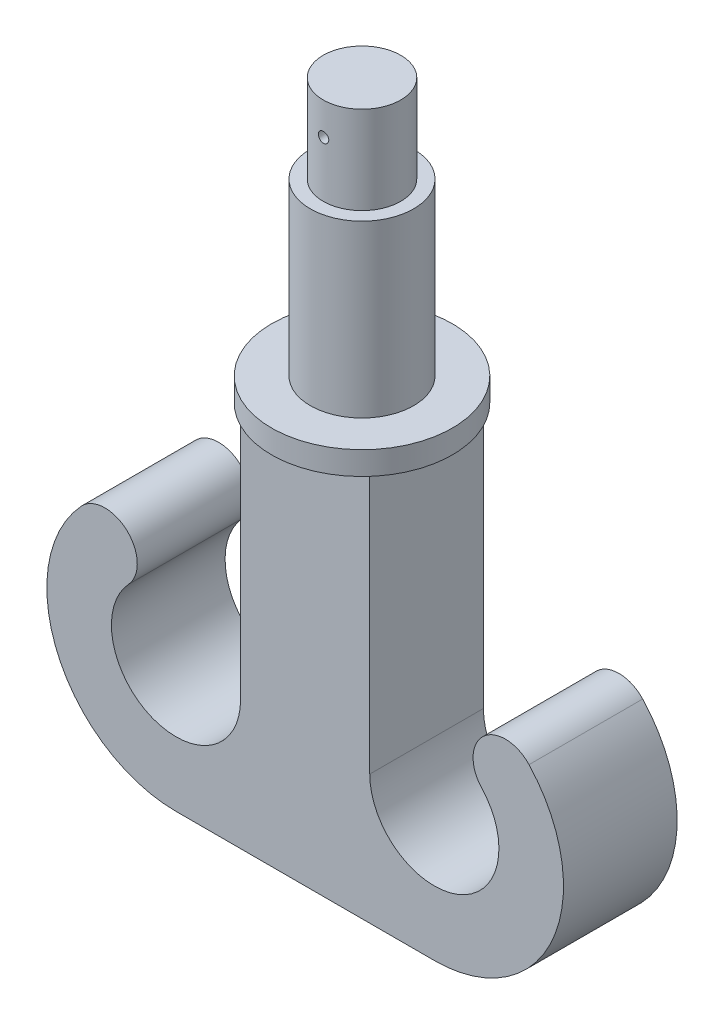
ISO-10303-21;
HEADER;
FILE_DESCRIPTION(('STEP AP214'),'2;1');
FILE_NAME('part.step','',(''),(''),'','','');
FILE_SCHEMA(('AUTOMOTIVE_DESIGN { 1 0 10303 214 1 1 1 1 }'));
ENDSEC;
DATA;
#1=APPLICATION_CONTEXT('core data for automotive mechanical design processes');
#2=APPLICATION_PROTOCOL_DEFINITION('international standard','automotive_design',2000,#1);
#3=PRODUCT_CONTEXT('',#1,'mechanical');
#4=PRODUCT('Part','Part','',(#3));
#5=PRODUCT_RELATED_PRODUCT_CATEGORY('part','',(#4));
#6=PRODUCT_DEFINITION_FORMATION('','',#4);
#7=PRODUCT_DEFINITION_CONTEXT('part definition',#1,'design');
#8=PRODUCT_DEFINITION('design','',#6,#7);
#9=PRODUCT_DEFINITION_SHAPE('','',#8);
#10=(LENGTH_UNIT() NAMED_UNIT(*) SI_UNIT(.MILLI.,.METRE.));
#11=(NAMED_UNIT(*) PLANE_ANGLE_UNIT() SI_UNIT($,.RADIAN.));
#12=(NAMED_UNIT(*) SI_UNIT($,.STERADIAN.) SOLID_ANGLE_UNIT());
#13=UNCERTAINTY_MEASURE_WITH_UNIT(LENGTH_MEASURE(1.E-05),#10,'distance_accuracy_value','');
#14=(GEOMETRIC_REPRESENTATION_CONTEXT(3) GLOBAL_UNCERTAINTY_ASSIGNED_CONTEXT((#13)) GLOBAL_UNIT_ASSIGNED_CONTEXT((#10,
#11,#12)) REPRESENTATION_CONTEXT('',''));
#15=CARTESIAN_POINT('',(0.,0.,0.));
#16=DIRECTION('',(0.,0.,1.));
#17=DIRECTION('',(1.,0.,0.));
#18=AXIS2_PLACEMENT_3D('',#15,#16,#17);
#19=CARTESIAN_POINT('',(77.4954541697351,75.5,22.));
#20=DIRECTION('',(0.,0.,-1.));
#21=DIRECTION('',(-1.,0.,0.));
#22=AXIS2_PLACEMENT_3D('',#19,#20,#21);
#23=CYLINDRICAL_SURFACE('',#22,12.5);
#24=CARTESIAN_POINT('',(77.4954541697351,75.5,-22.));
#25=DIRECTION('',(0.,0.,1.));
#26=DIRECTION('',(-1.,0.,0.));
#27=AXIS2_PLACEMENT_3D('',#24,#25,#26);
#28=CIRCLE('',#27,12.5);
#29=CARTESIAN_POINT('',(86.6606055596468,84.,-22.));
#30=VERTEX_POINT('',#29);
#31=CARTESIAN_POINT('',(68.3303027798234,67.,-22.));
#32=VERTEX_POINT('',#31);
#33=EDGE_CURVE('E164',#30,#32,#28,.T.);
#34=ORIENTED_EDGE('',*,*,#33,.T.);
#35=DIRECTION('',(0.,0.,-1.));
#36=VECTOR('',#35,1.);
#37=CARTESIAN_POINT('',(68.3303027798234,67.,22.));
#38=LINE('',#37,#36);
#39=CARTESIAN_POINT('',(68.3303027798234,67.,22.));
#40=VERTEX_POINT('',#39);
#41=EDGE_CURVE('E11',#40,#32,#38,.T.);
#42=ORIENTED_EDGE('',*,*,#41,.F.);
#43=CARTESIAN_POINT('',(77.4954541697351,75.5,22.));
#44=DIRECTION('',(0.,0.,1.));
#45=DIRECTION('',(-1.,0.,0.));
#46=AXIS2_PLACEMENT_3D('',#43,#44,#45);
#47=CIRCLE('',#46,12.5);
#48=CARTESIAN_POINT('',(86.6606055596468,84.,22.));
#49=VERTEX_POINT('',#48);
#50=EDGE_CURVE('E195',#49,#40,#47,.T.);
#51=ORIENTED_EDGE('',*,*,#50,.F.);
#52=DIRECTION('',(0.,0.,-1.));
#53=VECTOR('',#52,1.);
#54=CARTESIAN_POINT('',(86.6606055596468,84.,22.));
#55=LINE('',#54,#53);
#56=EDGE_CURVE('E160',#49,#30,#55,.T.);
#57=ORIENTED_EDGE('',*,*,#56,.T.);
#58=EDGE_LOOP('',(#34,#42,#51,#57));
#59=FACE_BOUND('',#58,.T.);
#60=ADVANCED_FACE('F45',(#59),#23,.T.);
#61=CARTESIAN_POINT('',(50.,50.,22.));
#62=DIRECTION('',(0.,0.,-1.));
#63=DIRECTION('',(-1.,0.,0.));
#64=AXIS2_PLACEMENT_3D('',#61,#62,#63);
#65=CYLINDRICAL_SURFACE('',#64,25.);
#66=CARTESIAN_POINT('',(50.,50.,-22.));
#67=DIRECTION('',(0.,0.,-1.));
#68=DIRECTION('',(-1.,0.,0.));
#69=AXIS2_PLACEMENT_3D('',#66,#67,#68);
#70=CIRCLE('',#69,25.);
#71=CARTESIAN_POINT('',(25.,50.,-22.));
#72=VERTEX_POINT('',#71);
#73=EDGE_CURVE('E168',#32,#72,#70,.T.);
#74=ORIENTED_EDGE('',*,*,#73,.T.);
#75=DIRECTION('',(0.,0.,-1.));
#76=VECTOR('',#75,1.);
#77=CARTESIAN_POINT('',(25.,50.,22.));
#78=LINE('',#77,#76);
#79=CARTESIAN_POINT('',(25.,50.,22.));
#80=VERTEX_POINT('',#79);
#81=EDGE_CURVE('E60',#80,#72,#78,.T.);
#82=ORIENTED_EDGE('',*,*,#81,.F.);
#83=CARTESIAN_POINT('',(50.,50.,22.));
#84=DIRECTION('',(0.,0.,-1.));
#85=DIRECTION('',(-1.,0.,0.));
#86=AXIS2_PLACEMENT_3D('',#83,#84,#85);
#87=CIRCLE('',#86,25.);
#88=EDGE_CURVE('E116',#40,#80,#87,.T.);
#89=ORIENTED_EDGE('',*,*,#88,.F.);
#90=ORIENTED_EDGE('',*,*,#41,.T.);
#91=EDGE_LOOP('',(#74,#82,#89,#90));
#92=FACE_BOUND('',#91,.T.);
#93=ADVANCED_FACE('F245',(#92),#65,.F.);
#94=CARTESIAN_POINT('',(25.,50.,22.));
#95=DIRECTION('',(-1.,0.,0.));
#96=DIRECTION('',(0.,0.,1.));
#97=AXIS2_PLACEMENT_3D('',#94,#95,#96);
#98=PLANE('',#97);
#99=DIRECTION('',(0.,1.,0.));
#100=VECTOR('',#99,1.);
#101=CARTESIAN_POINT('',(25.,50.,-22.));
#102=LINE('',#101,#100);
#103=CARTESIAN_POINT('',(25.,151.,-22.));
#104=VERTEX_POINT('',#103);
#105=EDGE_CURVE('E172',#72,#104,#102,.T.);
#106=ORIENTED_EDGE('',*,*,#105,.T.);
#107=DIRECTION('',(0.,0.,-1.));
#108=VECTOR('',#107,1.);
#109=CARTESIAN_POINT('',(25.,151.,22.));
#110=LINE('',#109,#108);
#111=CARTESIAN_POINT('',(25.,151.,22.));
#112=VERTEX_POINT('',#111);
#113=EDGE_CURVE('E213',#112,#104,#110,.T.);
#114=ORIENTED_EDGE('',*,*,#113,.F.);
#115=DIRECTION('',(0.,1.,0.));
#116=VECTOR('',#115,1.);
#117=CARTESIAN_POINT('',(25.,50.,22.));
#118=LINE('',#117,#116);
#119=EDGE_CURVE('E261',#80,#112,#118,.T.);
#120=ORIENTED_EDGE('',*,*,#119,.F.);
#121=ORIENTED_EDGE('',*,*,#81,.T.);
#122=EDGE_LOOP('',(#106,#114,#120,#121));
#123=FACE_BOUND('',#122,.T.);
#124=ADVANCED_FACE('F250',(#123),#98,.F.);
#125=CARTESIAN_POINT('',(-25.,50.,22.));
#126=DIRECTION('',(1.,0.,0.));
#127=DIRECTION('',(0.,0.,-1.));
#128=AXIS2_PLACEMENT_3D('',#125,#126,#127);
#129=PLANE('',#128);
#130=DIRECTION('',(0.,-1.,0.));
#131=VECTOR('',#130,1.);
#132=CARTESIAN_POINT('',(-25.,50.,-22.));
#133=LINE('',#132,#131);
#134=CARTESIAN_POINT('',(-25.,151.,-22.));
#135=VERTEX_POINT('',#134);
#136=CARTESIAN_POINT('',(-25.,50.,-22.));
#137=VERTEX_POINT('',#136);
#138=EDGE_CURVE('E180',#135,#137,#133,.T.);
#139=ORIENTED_EDGE('',*,*,#138,.T.);
#140=DIRECTION('',(0.,0.,-1.));
#141=VECTOR('',#140,1.);
#142=CARTESIAN_POINT('',(-25.,50.,22.));
#143=LINE('',#142,#141);
#144=CARTESIAN_POINT('',(-25.,50.,22.));
#145=VERTEX_POINT('',#144);
#146=EDGE_CURVE('E206',#145,#137,#143,.T.);
#147=ORIENTED_EDGE('',*,*,#146,.F.);
#148=DIRECTION('',(0.,-1.,0.));
#149=VECTOR('',#148,1.);
#150=CARTESIAN_POINT('',(-25.,50.,22.));
#151=LINE('',#150,#149);
#152=CARTESIAN_POINT('',(-25.,151.,22.));
#153=VERTEX_POINT('',#152);
#154=EDGE_CURVE('E268',#153,#145,#151,.T.);
#155=ORIENTED_EDGE('',*,*,#154,.F.);
#156=DIRECTION('',(0.,0.,-1.));
#157=VECTOR('',#156,1.);
#158=CARTESIAN_POINT('',(-25.,151.,22.));
#159=LINE('',#158,#157);
#160=EDGE_CURVE('E210',#153,#135,#159,.T.);
#161=ORIENTED_EDGE('',*,*,#160,.T.);
#162=EDGE_LOOP('',(#139,#147,#155,#161));
#163=FACE_BOUND('',#162,.T.);
#164=ADVANCED_FACE('F293',(#163),#129,.F.);
#165=CARTESIAN_POINT('',(-50.,50.,22.));
#166=DIRECTION('',(0.,0.,-1.));
#167=DIRECTION('',(-1.,0.,0.));
#168=AXIS2_PLACEMENT_3D('',#165,#166,#167);
#169=CYLINDRICAL_SURFACE('',#168,25.);
#170=CARTESIAN_POINT('',(-50.,50.,-22.));
#171=DIRECTION('',(0.,0.,-1.));
#172=DIRECTION('',(1.,0.,0.));
#173=AXIS2_PLACEMENT_3D('',#170,#171,#172);
#174=CIRCLE('',#173,25.);
#175=CARTESIAN_POINT('',(-68.3303027798234,67.,-22.));
#176=VERTEX_POINT('',#175);
#177=EDGE_CURVE('E183',#137,#176,#174,.T.);
#178=ORIENTED_EDGE('',*,*,#177,.T.);
#179=DIRECTION('',(0.,0.,-1.));
#180=VECTOR('',#179,1.);
#181=CARTESIAN_POINT('',(-68.3303027798234,67.,22.));
#182=LINE('',#181,#180);
#183=CARTESIAN_POINT('',(-68.3303027798234,67.,22.));
#184=VERTEX_POINT('',#183);
#185=EDGE_CURVE('E202',#184,#176,#182,.T.);
#186=ORIENTED_EDGE('',*,*,#185,.F.);
#187=CARTESIAN_POINT('',(-50.,50.,22.));
#188=DIRECTION('',(0.,0.,-1.));
#189=DIRECTION('',(1.,0.,0.));
#190=AXIS2_PLACEMENT_3D('',#187,#188,#189);
#191=CIRCLE('',#190,25.);
#192=EDGE_CURVE('E275',#145,#184,#191,.T.);
#193=ORIENTED_EDGE('',*,*,#192,.F.);
#194=ORIENTED_EDGE('',*,*,#146,.T.);
#195=EDGE_LOOP('',(#178,#186,#193,#194));
#196=FACE_BOUND('',#195,.T.);
#197=ADVANCED_FACE('F283',(#196),#169,.F.);
#198=CARTESIAN_POINT('',(-77.4954541697351,75.5,22.));
#199=DIRECTION('',(0.,0.,-1.));
#200=DIRECTION('',(-1.,0.,0.));
#201=AXIS2_PLACEMENT_3D('',#198,#199,#200);
#202=CYLINDRICAL_SURFACE('',#201,12.5);
#203=CARTESIAN_POINT('',(-77.4954541697351,75.5,-22.));
#204=DIRECTION('',(0.,0.,1.));
#205=DIRECTION('',(1.,0.,0.));
#206=AXIS2_PLACEMENT_3D('',#203,#204,#205);
#207=CIRCLE('',#206,12.5);
#208=CARTESIAN_POINT('',(-86.6606055596467,84.,-22.));
#209=VERTEX_POINT('',#208);
#210=EDGE_CURVE('E186',#176,#209,#207,.T.);
#211=ORIENTED_EDGE('',*,*,#210,.T.);
#212=DIRECTION('',(0.,0.,-1.));
#213=VECTOR('',#212,1.);
#214=CARTESIAN_POINT('',(-86.6606055596467,84.,22.));
#215=LINE('',#214,#213);
#216=CARTESIAN_POINT('',(-86.6606055596467,84.,22.));
#217=VERTEX_POINT('',#216);
#218=EDGE_CURVE('E153',#217,#209,#215,.T.);
#219=ORIENTED_EDGE('',*,*,#218,.F.);
#220=CARTESIAN_POINT('',(-77.4954541697351,75.5,22.));
#221=DIRECTION('',(0.,0.,1.));
#222=DIRECTION('',(1.,0.,0.));
#223=AXIS2_PLACEMENT_3D('',#220,#221,#222);
#224=CIRCLE('',#223,12.5);
#225=EDGE_CURVE('E142',#184,#217,#224,.T.);
#226=ORIENTED_EDGE('',*,*,#225,.F.);
#227=ORIENTED_EDGE('',*,*,#185,.T.);
#228=EDGE_LOOP('',(#211,#219,#226,#227));
#229=FACE_BOUND('',#228,.T.);
#230=ADVANCED_FACE('F287',(#229),#202,.T.);
#231=CARTESIAN_POINT('',(-50.,50.,22.));
#232=DIRECTION('',(0.,0.,-1.));
#233=DIRECTION('',(-1.,0.,0.));
#234=AXIS2_PLACEMENT_3D('',#231,#232,#233);
#235=CYLINDRICAL_SURFACE('',#234,50.);
#236=CARTESIAN_POINT('',(-50.,50.,-22.));
#237=DIRECTION('',(0.,0.,1.));
#238=DIRECTION('',(1.,0.,0.));
#239=AXIS2_PLACEMENT_3D('',#236,#237,#238);
#240=CIRCLE('',#239,50.);
#241=CARTESIAN_POINT('',(-50.,0.,-22.));
#242=VERTEX_POINT('',#241);
#243=EDGE_CURVE('E151',#209,#242,#240,.T.);
#244=ORIENTED_EDGE('',*,*,#243,.T.);
#245=DIRECTION('',(0.,0.,-1.));
#246=VECTOR('',#245,1.);
#247=CARTESIAN_POINT('',(-50.,0.,22.));
#248=LINE('',#247,#246);
#249=CARTESIAN_POINT('',(-50.,0.,22.));
#250=VERTEX_POINT('',#249);
#251=EDGE_CURVE('E148',#250,#242,#248,.T.);
#252=ORIENTED_EDGE('',*,*,#251,.F.);
#253=CARTESIAN_POINT('',(-50.,50.,22.));
#254=DIRECTION('',(0.,0.,1.));
#255=DIRECTION('',(1.,0.,0.));
#256=AXIS2_PLACEMENT_3D('',#253,#254,#255);
#257=CIRCLE('',#256,50.);
#258=EDGE_CURVE('E136',#217,#250,#257,.T.);
#259=ORIENTED_EDGE('',*,*,#258,.F.);
#260=ORIENTED_EDGE('',*,*,#218,.T.);
#261=EDGE_LOOP('',(#244,#252,#259,#260));
#262=FACE_BOUND('',#261,.T.);
#263=ADVANCED_FACE('F149',(#262),#235,.T.);
#264=CARTESIAN_POINT('',(-50.,0.,22.));
#265=DIRECTION('',(0.,1.,0.));
#266=DIRECTION('',(0.,0.,1.));
#267=AXIS2_PLACEMENT_3D('',#264,#265,#266);
#268=PLANE('',#267);
#269=DIRECTION('',(1.,0.,0.));
#270=VECTOR('',#269,1.);
#271=CARTESIAN_POINT('',(-50.,0.,-22.));
#272=LINE('',#271,#270);
#273=CARTESIAN_POINT('',(50.,0.,-22.));
#274=VERTEX_POINT('',#273);
#275=EDGE_CURVE('E102',#242,#274,#272,.T.);
#276=ORIENTED_EDGE('',*,*,#275,.T.);
#277=DIRECTION('',(0.,0.,-1.));
#278=VECTOR('',#277,1.);
#279=CARTESIAN_POINT('',(50.,0.,22.));
#280=LINE('',#279,#278);
#281=CARTESIAN_POINT('',(50.,0.,22.));
#282=VERTEX_POINT('',#281);
#283=EDGE_CURVE('E154',#282,#274,#280,.T.);
#284=ORIENTED_EDGE('',*,*,#283,.F.);
#285=DIRECTION('',(1.,0.,0.));
#286=VECTOR('',#285,1.);
#287=CARTESIAN_POINT('',(-50.,0.,22.));
#288=LINE('',#287,#286);
#289=EDGE_CURVE('E140',#250,#282,#288,.T.);
#290=ORIENTED_EDGE('',*,*,#289,.F.);
#291=ORIENTED_EDGE('',*,*,#251,.T.);
#292=EDGE_LOOP('',(#276,#284,#290,#291));
#293=FACE_BOUND('',#292,.T.);
#294=ADVANCED_FACE('F156',(#293),#268,.F.);
#295=CARTESIAN_POINT('',(50.,50.,22.));
#296=DIRECTION('',(0.,0.,-1.));
#297=DIRECTION('',(-1.,0.,0.));
#298=AXIS2_PLACEMENT_3D('',#295,#296,#297);
#299=CYLINDRICAL_SURFACE('',#298,50.);
#300=CARTESIAN_POINT('',(50.,50.,-22.));
#301=DIRECTION('',(0.,0.,1.));
#302=DIRECTION('',(-1.,0.,0.));
#303=AXIS2_PLACEMENT_3D('',#300,#301,#302);
#304=CIRCLE('',#303,50.);
#305=EDGE_CURVE('E108',#274,#30,#304,.T.);
#306=ORIENTED_EDGE('',*,*,#305,.T.);
#307=ORIENTED_EDGE('',*,*,#56,.F.);
#308=CARTESIAN_POINT('',(50.,50.,22.));
#309=DIRECTION('',(0.,0.,1.));
#310=DIRECTION('',(-1.,0.,0.));
#311=AXIS2_PLACEMENT_3D('',#308,#309,#310);
#312=CIRCLE('',#311,50.);
#313=EDGE_CURVE('E69',#282,#49,#312,.T.);
#314=ORIENTED_EDGE('',*,*,#313,.F.);
#315=ORIENTED_EDGE('',*,*,#283,.T.);
#316=EDGE_LOOP('',(#306,#307,#314,#315));
#317=FACE_BOUND('',#316,.T.);
#318=ADVANCED_FACE('F310',(#317),#299,.T.);
#319=CARTESIAN_POINT('',(77.4954541697351,75.5,22.));
#320=DIRECTION('',(0.,0.,-1.));
#321=DIRECTION('',(-1.,0.,0.));
#322=AXIS2_PLACEMENT_3D('',#319,#320,#321);
#323=PLANE('',#322);
#324=ORIENTED_EDGE('',*,*,#50,.T.);
#325=ORIENTED_EDGE('',*,*,#88,.T.);
#326=ORIENTED_EDGE('',*,*,#119,.T.);
#327=DIRECTION('',(-1.,0.,0.));
#328=VECTOR('',#327,1.);
#329=CARTESIAN_POINT('',(-25.,151.,22.));
#330=LINE('',#329,#328);
#331=EDGE_CURVE('E264',#112,#153,#330,.T.);
#332=ORIENTED_EDGE('',*,*,#331,.T.);
#333=ORIENTED_EDGE('',*,*,#154,.T.);
#334=ORIENTED_EDGE('',*,*,#192,.T.);
#335=ORIENTED_EDGE('',*,*,#225,.T.);
#336=ORIENTED_EDGE('',*,*,#258,.T.);
#337=ORIENTED_EDGE('',*,*,#289,.T.);
#338=ORIENTED_EDGE('',*,*,#313,.T.);
#339=EDGE_LOOP('',(#324,#325,#326,#332,#333,#334,#335,#336,#337,#338));
#340=FACE_BOUND('',#339,.T.);
#341=ADVANCED_FACE('F138',(#340),#323,.F.);
#342=CARTESIAN_POINT('',(77.4954541697351,75.5,-22.));
#343=DIRECTION('',(0.,0.,-1.));
#344=DIRECTION('',(-1.,0.,0.));
#345=AXIS2_PLACEMENT_3D('',#342,#343,#344);
#346=PLANE('',#345);
#347=ORIENTED_EDGE('',*,*,#33,.F.);
#348=ORIENTED_EDGE('',*,*,#305,.F.);
#349=ORIENTED_EDGE('',*,*,#275,.F.);
#350=ORIENTED_EDGE('',*,*,#243,.F.);
#351=ORIENTED_EDGE('',*,*,#210,.F.);
#352=ORIENTED_EDGE('',*,*,#177,.F.);
#353=ORIENTED_EDGE('',*,*,#138,.F.);
#354=DIRECTION('',(-1.,0.,0.));
#355=VECTOR('',#354,1.);
#356=CARTESIAN_POINT('',(-25.,151.,-22.));
#357=LINE('',#356,#355);
#358=EDGE_CURVE('E176',#104,#135,#357,.T.);
#359=ORIENTED_EDGE('',*,*,#358,.F.);
#360=ORIENTED_EDGE('',*,*,#105,.F.);
#361=ORIENTED_EDGE('',*,*,#73,.F.);
#362=EDGE_LOOP('',(#347,#348,#349,#350,#351,#352,#353,#359,#360,#361));
#363=FACE_BOUND('',#362,.T.);
#364=ADVANCED_FACE('F255',(#363),#346,.T.);
#365=CARTESIAN_POINT('',(0.,151.,0.));
#366=DIRECTION('',(0.,1.,0.));
#367=DIRECTION('',(-1.,0.,0.));
#368=AXIS2_PLACEMENT_3D('',#365,#366,#367);
#369=PLANE('',#368);
#370=CARTESIAN_POINT('',(0.,151.,0.));
#371=DIRECTION('',(0.,1.,0.));
#372=DIRECTION('',(-1.,0.,0.));
#373=AXIS2_PLACEMENT_3D('',#370,#371,#372);
#374=CIRCLE('',#373,35.);
#375=CARTESIAN_POINT('',(-35.,151.,0.));
#376=VERTEX_POINT('',#375);
#377=EDGE_CURVE('E169',#376,#376,#374,.T.);
#378=ORIENTED_EDGE('',*,*,#377,.F.);
#379=EDGE_LOOP('',(#378));
#380=FACE_BOUND('',#379,.T.);
#381=ORIENTED_EDGE('',*,*,#113,.T.);
#382=ORIENTED_EDGE('',*,*,#358,.T.);
#383=ORIENTED_EDGE('',*,*,#160,.F.);
#384=ORIENTED_EDGE('',*,*,#331,.F.);
#385=EDGE_LOOP('',(#381,#382,#383,#384));
#386=FACE_BOUND('',#385,.T.);
#387=ADVANCED_FACE('F292',(#380,#386),#369,.F.);
#388=CARTESIAN_POINT('',(0.,260.,0.));
#389=DIRECTION('',(0.,1.,0.));
#390=DIRECTION('',(-1.,0.,0.));
#391=AXIS2_PLACEMENT_3D('',#388,#389,#390);
#392=CYLINDRICAL_SURFACE('',#391,35.);
#393=CARTESIAN_POINT('',(0.,160.,0.));
#394=DIRECTION('',(0.,1.,0.));
#395=DIRECTION('',(-1.,0.,0.));
#396=AXIS2_PLACEMENT_3D('',#393,#394,#395);
#397=CIRCLE('',#396,35.);
#398=CARTESIAN_POINT('',(-35.,160.,0.));
#399=VERTEX_POINT('',#398);
#400=EDGE_CURVE('E346',#399,#399,#397,.T.);
#401=ORIENTED_EDGE('',*,*,#400,.F.);
#402=EDGE_LOOP('',(#401));
#403=FACE_BOUND('',#402,.T.);
#404=ORIENTED_EDGE('',*,*,#377,.T.);
#405=EDGE_LOOP('',(#404));
#406=FACE_BOUND('',#405,.T.);
#407=ADVANCED_FACE('F318',(#403,#406),#392,.T.);
#408=CARTESIAN_POINT('',(35.,160.,0.));
#409=DIRECTION('',(0.,-1.,0.));
#410=DIRECTION('',(1.,0.,0.));
#411=AXIS2_PLACEMENT_3D('',#408,#409,#410);
#412=PLANE('',#411);
#413=CARTESIAN_POINT('',(0.,160.,0.));
#414=DIRECTION('',(0.,1.,0.));
#415=DIRECTION('',(-1.,0.,0.));
#416=AXIS2_PLACEMENT_3D('',#413,#414,#415);
#417=CIRCLE('',#416,20.);
#418=CARTESIAN_POINT('',(-20.,160.,0.));
#419=VERTEX_POINT('',#418);
#420=EDGE_CURVE('E341',#419,#419,#417,.T.);
#421=ORIENTED_EDGE('',*,*,#420,.F.);
#422=EDGE_LOOP('',(#421));
#423=FACE_BOUND('',#422,.T.);
#424=ORIENTED_EDGE('',*,*,#400,.T.);
#425=EDGE_LOOP('',(#424));
#426=FACE_BOUND('',#425,.T.);
#427=ADVANCED_FACE('F322',(#423,#426),#412,.F.);
#428=CARTESIAN_POINT('',(0.,260.,0.));
#429=DIRECTION('',(0.,1.,0.));
#430=DIRECTION('',(-1.,0.,0.));
#431=AXIS2_PLACEMENT_3D('',#428,#429,#430);
#432=CYLINDRICAL_SURFACE('',#431,20.);
#433=CARTESIAN_POINT('',(0.,226.,0.));
#434=DIRECTION('',(0.,1.,0.));
#435=DIRECTION('',(-1.,0.,0.));
#436=AXIS2_PLACEMENT_3D('',#433,#434,#435);
#437=CIRCLE('',#436,20.);
#438=CARTESIAN_POINT('',(-20.,226.,0.));
#439=VERTEX_POINT('',#438);
#440=EDGE_CURVE('E339',#439,#439,#437,.T.);
#441=ORIENTED_EDGE('',*,*,#440,.F.);
#442=EDGE_LOOP('',(#441));
#443=FACE_BOUND('',#442,.T.);
#444=ORIENTED_EDGE('',*,*,#420,.T.);
#445=EDGE_LOOP('',(#444));
#446=FACE_BOUND('',#445,.T.);
#447=ADVANCED_FACE('F326',(#443,#446),#432,.T.);
#448=CARTESIAN_POINT('',(20.,226.,0.));
#449=DIRECTION('',(0.,-1.,0.));
#450=DIRECTION('',(1.,0.,0.));
#451=AXIS2_PLACEMENT_3D('',#448,#449,#450);
#452=PLANE('',#451);
#453=CARTESIAN_POINT('',(0.,226.,0.));
#454=DIRECTION('',(0.,1.,0.));
#455=DIRECTION('',(-1.,0.,0.));
#456=AXIS2_PLACEMENT_3D('',#453,#454,#455);
#457=CIRCLE('',#456,15.);
#458=CARTESIAN_POINT('',(-15.,226.,0.));
#459=VERTEX_POINT('',#458);
#460=EDGE_CURVE('E336',#459,#459,#457,.T.);
#461=ORIENTED_EDGE('',*,*,#460,.F.);
#462=EDGE_LOOP('',(#461));
#463=FACE_BOUND('',#462,.T.);
#464=ORIENTED_EDGE('',*,*,#440,.T.);
#465=EDGE_LOOP('',(#464));
#466=FACE_BOUND('',#465,.T.);
#467=ADVANCED_FACE('F241',(#463,#466),#452,.F.);
#468=CARTESIAN_POINT('',(0.,260.,0.));
#469=DIRECTION('',(0.,1.,0.));
#470=DIRECTION('',(-1.,0.,0.));
#471=AXIS2_PLACEMENT_3D('',#468,#469,#470);
#472=CYLINDRICAL_SURFACE('',#471,15.);
#473=CARTESIAN_POINT('',(2.,247.5,-14.8660687473185));
#474=CARTESIAN_POINT('',(1.99999528594759,247.611803855468,-14.8660704451043));
#475=CARTESIAN_POINT('',(1.99059326704128,247.723676033116,-14.8673436464034));
#476=CARTESIAN_POINT('',(1.9532379626613,247.944302462336,-14.8722964859732));
#477=CARTESIAN_POINT('',(1.92526569649113,248.053053404917,-14.8759785863295));
#478=CARTESIAN_POINT('',(1.85161311140264,248.264211368226,-14.8853249214529));
#479=CARTESIAN_POINT('',(1.80594530275044,248.366622811618,-14.8909877556206));
#480=CARTESIAN_POINT('',(1.69822564880686,248.56231107571,-14.9036558225185));
#481=CARTESIAN_POINT('',(1.63617643263469,248.655589358938,-14.9106608397868));
#482=CARTESIAN_POINT('',(1.49703370489518,248.830973454668,-14.9252737732073));
#483=CARTESIAN_POINT('',(1.4198568227486,248.913012865679,-14.9328848849373));
#484=CARTESIAN_POINT('',(1.25282922872611,249.063016245456,-14.9478237625823));
#485=CARTESIAN_POINT('',(1.16297786647199,249.130979491476,-14.9551515139324));
#486=CARTESIAN_POINT('',(0.972731724927619,249.251141841716,-14.9687309976037));
#487=CARTESIAN_POINT('',(0.872298437711228,249.30328048929,-14.9749785650228));
#488=CARTESIAN_POINT('',(0.664003816037371,249.389926164181,-14.9856585341581));
#489=CARTESIAN_POINT('',(0.556142793922404,249.424433932378,-14.990091012146));
#490=CARTESIAN_POINT('',(0.336735375014092,249.47463890958,-14.9966188619561));
#491=CARTESIAN_POINT('',(0.225214723469899,249.490446815012,-14.9987279820508));
#492=CARTESIAN_POINT('',(0.00108500230365613,249.503146608737,-15.0004184797152));
#493=CARTESIAN_POINT('',(-0.111524018722467,249.500039337737,-14.9999999696283));
#494=CARTESIAN_POINT('',(-0.333880124465771,249.475085269459,-14.9966934411691));
#495=CARTESIAN_POINT('',(-0.443640837361788,249.453357535254,-14.9938211133781));
#496=CARTESIAN_POINT('',(-0.657944122712557,249.391965672979,-14.9859472409229));
#497=CARTESIAN_POINT('',(-0.762486584541839,249.352301164832,-14.9809456511403));
#498=CARTESIAN_POINT('',(-0.963751808424128,249.256036558878,-14.9693481900416));
#499=CARTESIAN_POINT('',(-1.06044984935326,249.199385376817,-14.9627475214588));
#500=CARTESIAN_POINT('',(-1.24301169073479,249.070792742717,-14.9486895041904));
#501=CARTESIAN_POINT('',(-1.32887492586682,248.998850493372,-14.9412321108429));
#502=CARTESIAN_POINT('',(-1.48803006154539,248.841052151641,-14.9262258809566));
#503=CARTESIAN_POINT('',(-1.56121903353021,248.755092231806,-14.918676784244));
#504=CARTESIAN_POINT('',(-1.69214693057191,248.572054068627,-14.9043949876924));
#505=CARTESIAN_POINT('',(-1.74988579436353,248.474975781197,-14.8976622910907));
#506=CARTESIAN_POINT('',(-1.848282860865,248.272359999653,-14.8857757633434));
#507=CARTESIAN_POINT('',(-1.88893208906706,248.166818095482,-14.8806227621479));
#508=CARTESIAN_POINT('',(-1.95190090044924,247.950321979362,-14.8724947546572));
#509=CARTESIAN_POINT('',(-1.97422149354144,247.839368065973,-14.8695196283616));
#510=CARTESIAN_POINT('',(-1.99976160768727,247.616108664995,-14.8661064501035));
#511=CARTESIAN_POINT('',(-2.00312631098812,247.503820069667,-14.8656491151163));
#512=CARTESIAN_POINT('',(-1.99104288188796,247.280280743895,-14.867272242967));
#513=CARTESIAN_POINT('',(-1.97559520729777,247.169029988261,-14.8693526440475));
#514=CARTESIAN_POINT('',(-1.9264480503702,246.951164013594,-14.8757992043677));
#515=CARTESIAN_POINT('',(-1.8928195032336,246.844532506982,-14.8801564778765));
#516=CARTESIAN_POINT('',(-1.80833845080126,246.638421086548,-14.8906585901441));
#517=CARTESIAN_POINT('',(-1.75748526209383,246.538941456676,-14.8968034998284));
#518=CARTESIAN_POINT('',(-1.63964406417211,246.349302689559,-14.9102344661952));
#519=CARTESIAN_POINT('',(-1.57256123166301,246.259202951632,-14.9175271378913));
#520=CARTESIAN_POINT('',(-1.424298323128,246.091489061563,-14.9324114351651));
#521=CARTESIAN_POINT('',(-1.34311762143754,246.013875463852,-14.9400030739993));
#522=CARTESIAN_POINT('',(-1.16832754835824,245.872823446079,-14.9546894865533));
#523=CARTESIAN_POINT('',(-1.07464064093253,245.809480683628,-14.9617807004972));
#524=CARTESIAN_POINT('',(-0.877872452317632,245.699431717825,-14.974613414783));
#525=CARTESIAN_POINT('',(-0.774791382513706,245.652725140244,-14.9803549454849));
#526=CARTESIAN_POINT('',(-0.562472772523435,245.577430738412,-14.9898256469115));
#527=CARTESIAN_POINT('',(-0.453254784247364,245.548788570916,-14.9935608482078));
#528=CARTESIAN_POINT('',(-0.231506493423199,245.510259514539,-14.9986231668662));
#529=CARTESIAN_POINT('',(-0.118976362199823,245.500371657292,-14.9999504085612));
#530=CARTESIAN_POINT('',(0.105269873711588,245.49965173276,-15.0000464724842));
#531=CARTESIAN_POINT('',(0.216985525921879,245.508672529406,-14.9988350491343));
#532=CARTESIAN_POINT('',(0.437297443052353,245.545201041232,-14.9940293321986));
#533=CARTESIAN_POINT('',(0.545893712341049,245.572708730521,-14.9904350419501));
#534=CARTESIAN_POINT('',(0.756858234588867,245.645382047077,-14.9812655664247));
#535=CARTESIAN_POINT('',(0.85922930154392,245.690539626408,-14.9756912840831));
#536=CARTESIAN_POINT('',(1.05496407863088,245.797215549646,-14.9631774939599));
#537=CARTESIAN_POINT('',(1.14832762239917,245.858734195652,-14.95623796097));
#538=CARTESIAN_POINT('',(1.32414728606674,245.996926682004,-14.9417029120984));
#539=CARTESIAN_POINT('',(1.40651715716401,246.073709790139,-14.9341029029987));
#540=CARTESIAN_POINT('',(1.55725895587217,246.240023069047,-14.919138648968));
#541=CARTESIAN_POINT('',(1.62562757530232,246.329556243921,-14.911774460102));
#542=CARTESIAN_POINT('',(1.74668790978496,246.519283941571,-14.8980810988492));
#543=CARTESIAN_POINT('',(1.79930940429127,246.61952359151,-14.8917566176026));
#544=CARTESIAN_POINT('',(1.88689518281491,246.827448467517,-14.8809136658427));
#545=CARTESIAN_POINT('',(1.92187839666366,246.935125569759,-14.8763932602426));
#546=CARTESIAN_POINT('',(1.96495480378583,247.119448278726,-14.8707513382361));
#547=CARTESIAN_POINT('',(1.97807748135802,247.194938272968,-14.8690042861798));
#548=CARTESIAN_POINT('',(1.99560165343182,247.34694150947,-14.866662414787));
#549=CARTESIAN_POINT('',(2.0000032274232,247.423454742397,-14.8660675849485));
#550=CARTESIAN_POINT('',(2.,247.5,-14.8660687473185));
#551=B_SPLINE_CURVE_WITH_KNOTS('',3,(#473,#474,#475,#476,#477,#478,#479,#480,#481,#482,#483,
#484,#485,#486,#487,#488,#489,#490,#491,#492,#493,#494,#495,#496,#497,#498,#499,#500,#501,#502,
#503,#504,#505,#506,#507,#508,#509,#510,#511,#512,#513,#514,#515,#516,#517,#518,#519,#520,#521,
#522,#523,#524,#525,#526,#527,#528,#529,#530,#531,#532,#533,#534,#535,#536,#537,#538,#539,#540,
#541,#542,#543,#544,#545,#546,#547,#548,#549,#550),.UNSPECIFIED.,.T.,.F.,(4,2,2,2,2,2,2,2,2,2,2,
2,2,2,2,2,2,2,2,2,2,2,2,2,2,2,2,2,2,2,2,2,2,2,2,2,2,2,4),(0.,0.335131889250452,
0.670606846105684,1.00584506276824,1.34102950834956,1.67811595121164,2.01521969762237,
2.35359556525146,2.69195721256928,3.02830569524969,3.36463922864857,3.69883808669953,
4.0330440266668,4.36826528456252,4.70350402584629,5.0413491506896,5.3791956151909,
5.71721927655741,6.05522431149105,6.3906370258193,6.72604157783541,7.06014684818594,
7.39426537618211,7.73038528142332,8.06652010750622,8.40484511764503,8.74316251675152,
9.08045723770336,9.41773454222148,9.75239709856301,10.0870591862064,10.421568853502,
10.7560846978108,11.0930874236895,11.430169684094,11.768733419821,12.1069330231324,
12.3363794094425,12.5658237044201),.UNSPECIFIED.);
#552=CARTESIAN_POINT('',(2.,247.5,-14.8660687473185));
#553=VERTEX_POINT('',#552);
#554=EDGE_CURVE('E48',#553,#553,#551,.T.);
#555=ORIENTED_EDGE('',*,*,#554,.T.);
#556=EDGE_LOOP('',(#555));
#557=FACE_BOUND('',#556,.T.);
#558=CARTESIAN_POINT('',(2.,247.5,14.8660687473185));
#559=CARTESIAN_POINT('',(1.99999528594759,247.388196144532,14.8660704451043));
#560=CARTESIAN_POINT('',(1.99059326704128,247.276323966884,14.8673436464034));
#561=CARTESIAN_POINT('',(1.9532379626613,247.055697537664,14.8722964859732));
#562=CARTESIAN_POINT('',(1.92526569649113,246.946946595083,14.8759785863295));
#563=CARTESIAN_POINT('',(1.85161311140264,246.735788631774,14.8853249214529));
#564=CARTESIAN_POINT('',(1.80594530275044,246.633377188382,14.8909877556206));
#565=CARTESIAN_POINT('',(1.69822564880686,246.43768892429,14.9036558225185));
#566=CARTESIAN_POINT('',(1.63617643263469,246.344410641062,14.9106608397868));
#567=CARTESIAN_POINT('',(1.49703370489518,246.169026545332,14.9252737732073));
#568=CARTESIAN_POINT('',(1.4198568227486,246.086987134321,14.9328848849373));
#569=CARTESIAN_POINT('',(1.25282922872611,245.936983754544,14.9478237625823));
#570=CARTESIAN_POINT('',(1.16297786647199,245.869020508524,14.9551515139324));
#571=CARTESIAN_POINT('',(0.972731724927619,245.748858158284,14.9687309976037));
#572=CARTESIAN_POINT('',(0.872298437711228,245.69671951071,14.9749785650228));
#573=CARTESIAN_POINT('',(0.664003816037371,245.610073835819,14.9856585341581));
#574=CARTESIAN_POINT('',(0.556142793922404,245.575566067622,14.990091012146));
#575=CARTESIAN_POINT('',(0.336735375014092,245.52536109042,14.9966188619561));
#576=CARTESIAN_POINT('',(0.2252147234699,245.509553184988,14.9987279820508));
#577=CARTESIAN_POINT('',(0.00108500230365719,245.496853391263,15.0004184797152));
#578=CARTESIAN_POINT('',(-0.111524018722466,245.499960662263,14.9999999696283));
#579=CARTESIAN_POINT('',(-0.333880124465771,245.524914730541,14.9966934411691));
#580=CARTESIAN_POINT('',(-0.443640837361788,245.546642464746,14.9938211133781));
#581=CARTESIAN_POINT('',(-0.657944122712557,245.608034327021,14.9859472409229));
#582=CARTESIAN_POINT('',(-0.762486584541839,245.647698835168,14.9809456511403));
#583=CARTESIAN_POINT('',(-0.963751808424128,245.743963441122,14.9693481900416));
#584=CARTESIAN_POINT('',(-1.06044984935326,245.800614623183,14.9627475214588));
#585=CARTESIAN_POINT('',(-1.24301169073479,245.929207257283,14.9486895041904));
#586=CARTESIAN_POINT('',(-1.32887492586682,246.001149506628,14.9412321108429));
#587=CARTESIAN_POINT('',(-1.48803006154539,246.158947848359,14.9262258809566));
#588=CARTESIAN_POINT('',(-1.56121903353021,246.244907768194,14.918676784244));
#589=CARTESIAN_POINT('',(-1.69214693057191,246.427945931373,14.9043949876924));
#590=CARTESIAN_POINT('',(-1.74988579436353,246.525024218803,14.8976622910907));
#591=CARTESIAN_POINT('',(-1.848282860865,246.727640000347,14.8857757633434));
#592=CARTESIAN_POINT('',(-1.88893208906706,246.833181904518,14.8806227621479));
#593=CARTESIAN_POINT('',(-1.95190090044924,247.049678020638,14.8724947546572));
#594=CARTESIAN_POINT('',(-1.97422149354144,247.160631934027,14.8695196283616));
#595=CARTESIAN_POINT('',(-1.99976160768727,247.383891335005,14.8661064501035));
#596=CARTESIAN_POINT('',(-2.00312631098812,247.496179930333,14.8656491151163));
#597=CARTESIAN_POINT('',(-1.99104288188796,247.719719256105,14.867272242967));
#598=CARTESIAN_POINT('',(-1.97559520729777,247.830970011739,14.8693526440475));
#599=CARTESIAN_POINT('',(-1.9264480503702,248.048835986406,14.8757992043677));
#600=CARTESIAN_POINT('',(-1.8928195032336,248.155467493018,14.8801564778765));
#601=CARTESIAN_POINT('',(-1.80833845080126,248.361578913452,14.8906585901441));
#602=CARTESIAN_POINT('',(-1.75748526209383,248.461058543324,14.8968034998284));
#603=CARTESIAN_POINT('',(-1.63964406417211,248.650697310441,14.9102344661952));
#604=CARTESIAN_POINT('',(-1.57256123166301,248.740797048368,14.9175271378913));
#605=CARTESIAN_POINT('',(-1.424298323128,248.908510938437,14.9324114351651));
#606=CARTESIAN_POINT('',(-1.34311762143755,248.986124536148,14.9400030739993));
#607=CARTESIAN_POINT('',(-1.16832754835824,249.127176553921,14.9546894865533));
#608=CARTESIAN_POINT('',(-1.07464064093252,249.190519316372,14.9617807004972));
#609=CARTESIAN_POINT('',(-0.877872452317614,249.300568282175,14.974613414783));
#610=CARTESIAN_POINT('',(-0.774791382513698,249.347274859756,14.9803549454849));
#611=CARTESIAN_POINT('',(-0.562472772523436,249.422569261588,14.9898256469115));
#612=CARTESIAN_POINT('',(-0.453254784247364,249.451211429084,14.9935608482078));
#613=CARTESIAN_POINT('',(-0.231506493423199,249.489740485461,14.9986231668662));
#614=CARTESIAN_POINT('',(-0.118976362199823,249.499628342708,14.9999504085612));
#615=CARTESIAN_POINT('',(0.105269873711588,249.50034826724,15.0000464724842));
#616=CARTESIAN_POINT('',(0.216985525921879,249.491327470594,14.9988350491343));
#617=CARTESIAN_POINT('',(0.437297443052353,249.454798958768,14.9940293321986));
#618=CARTESIAN_POINT('',(0.545893712341048,249.427291269479,14.9904350419501));
#619=CARTESIAN_POINT('',(0.756858234588854,249.354617952923,14.9812655664247));
#620=CARTESIAN_POINT('',(0.859229301543897,249.309460373592,14.9756912840831));
#621=CARTESIAN_POINT('',(1.05496407863086,249.202784450354,14.9631774939599));
#622=CARTESIAN_POINT('',(1.14832762239916,249.141265804348,14.95623796097));
#623=CARTESIAN_POINT('',(1.32414728606674,249.003073317996,14.9417029120984));
#624=CARTESIAN_POINT('',(1.40651715716401,248.926290209861,14.9341029029987));
#625=CARTESIAN_POINT('',(1.55725895587217,248.759976930953,14.919138648968));
#626=CARTESIAN_POINT('',(1.62562757530232,248.670443756079,14.911774460102));
#627=CARTESIAN_POINT('',(1.74668790978496,248.480716058429,14.8980810988492));
#628=CARTESIAN_POINT('',(1.79930940429127,248.38047640849,14.8917566176026));
#629=CARTESIAN_POINT('',(1.88689518281491,248.172551532483,14.8809136658427));
#630=CARTESIAN_POINT('',(1.92187839666366,248.064874430241,14.8763932602426));
#631=CARTESIAN_POINT('',(1.96495480378583,247.880551721274,14.8707513382361));
#632=CARTESIAN_POINT('',(1.97807748135802,247.805061727032,14.8690042861798));
#633=CARTESIAN_POINT('',(1.99560165343182,247.653058490529,14.866662414787));
#634=CARTESIAN_POINT('',(2.0000032274232,247.576545257603,14.8660675849485));
#635=CARTESIAN_POINT('',(2.,247.5,14.8660687473185));
#636=B_SPLINE_CURVE_WITH_KNOTS('',3,(#558,#559,#560,#561,#562,#563,#564,#565,#566,#567,#568,
#569,#570,#571,#572,#573,#574,#575,#576,#577,#578,#579,#580,#581,#582,#583,#584,#585,#586,#587,
#588,#589,#590,#591,#592,#593,#594,#595,#596,#597,#598,#599,#600,#601,#602,#603,#604,#605,#606,
#607,#608,#609,#610,#611,#612,#613,#614,#615,#616,#617,#618,#619,#620,#621,#622,#623,#624,#625,
#626,#627,#628,#629,#630,#631,#632,#633,#634,#635),.UNSPECIFIED.,.T.,.F.,(4,2,2,2,2,2,2,2,2,2,2,
2,2,2,2,2,2,2,2,2,2,2,2,2,2,2,2,2,2,2,2,2,2,2,2,2,2,2,4),(0.,0.335131889250452,
0.670606846105684,1.00584506276824,1.34102950834956,1.67811595121164,2.01521969762237,
2.35359556525146,2.69195721256928,3.02830569524969,3.36463922864857,3.69883808669953,
4.0330440266668,4.36826528456252,4.70350402584629,5.0413491506896,5.3791956151909,
5.71721927655741,6.05522431149105,6.3906370258193,6.72604157783541,7.06014684818594,
7.39426537618211,7.73038528142332,8.06652010750622,8.40484511764505,8.74316251675152,
9.08045723770335,9.41773454222147,9.75239709856301,10.0870591862064,10.4215688535019,
10.7560846978108,11.0930874236895,11.430169684094,11.768733419821,12.1069330231324,
12.3363794094425,12.5658237044201),.UNSPECIFIED.);
#637=CARTESIAN_POINT('',(2.,247.5,14.8660687473185));
#638=VERTEX_POINT('',#637);
#639=EDGE_CURVE('E219',#638,#638,#636,.T.);
#640=ORIENTED_EDGE('',*,*,#639,.T.);
#641=EDGE_LOOP('',(#640));
#642=FACE_BOUND('',#641,.T.);
#643=CARTESIAN_POINT('',(0.,260.,0.));
#644=DIRECTION('',(0.,1.,0.));
#645=DIRECTION('',(-1.,0.,0.));
#646=AXIS2_PLACEMENT_3D('',#643,#644,#645);
#647=CIRCLE('',#646,15.);
#648=CARTESIAN_POINT('',(-15.,260.,0.));
#649=VERTEX_POINT('',#648);
#650=EDGE_CURVE('E348',#649,#649,#647,.T.);
#651=ORIENTED_EDGE('',*,*,#650,.F.);
#652=EDGE_LOOP('',(#651));
#653=FACE_BOUND('',#652,.T.);
#654=ORIENTED_EDGE('',*,*,#460,.T.);
#655=EDGE_LOOP('',(#654));
#656=FACE_BOUND('',#655,.T.);
#657=ADVANCED_FACE('F225',(#557,#642,#653,#656),#472,.T.);
#658=CARTESIAN_POINT('',(15.,260.,0.));
#659=DIRECTION('',(0.,-1.,0.));
#660=DIRECTION('',(1.,0.,0.));
#661=AXIS2_PLACEMENT_3D('',#658,#659,#660);
#662=PLANE('',#661);
#663=ORIENTED_EDGE('',*,*,#650,.T.);
#664=EDGE_LOOP('',(#663));
#665=FACE_BOUND('',#664,.T.);
#666=ADVANCED_FACE('F232',(#665),#662,.F.);
#667=CARTESIAN_POINT('',(0.,247.5,-35.));
#668=DIRECTION('',(0.,0.,1.));
#669=DIRECTION('',(1.,0.,0.));
#670=AXIS2_PLACEMENT_3D('',#667,#668,#669);
#671=CYLINDRICAL_SURFACE('',#670,2.);
#672=ORIENTED_EDGE('',*,*,#639,.F.);
#673=EDGE_LOOP('',(#672));
#674=FACE_BOUND('',#673,.T.);
#675=ORIENTED_EDGE('',*,*,#554,.F.);
#676=EDGE_LOOP('',(#675));
#677=FACE_BOUND('',#676,.T.);
#678=ADVANCED_FACE('F229',(#674,#677),#671,.F.);
#679=CLOSED_SHELL('',(#60,#93,#124,#164,#197,#230,#263,#294,#318,#341,#364,#387,#407,#427,#447,
#467,#657,#666,#678));
#680=MANIFOLD_SOLID_BREP('B2',#679);
#681=ADVANCED_BREP_SHAPE_REPRESENTATION('',(#18,#680),#14);
#682=SHAPE_DEFINITION_REPRESENTATION(#9,#681);
ENDSEC;
END-ISO-10303-21;
